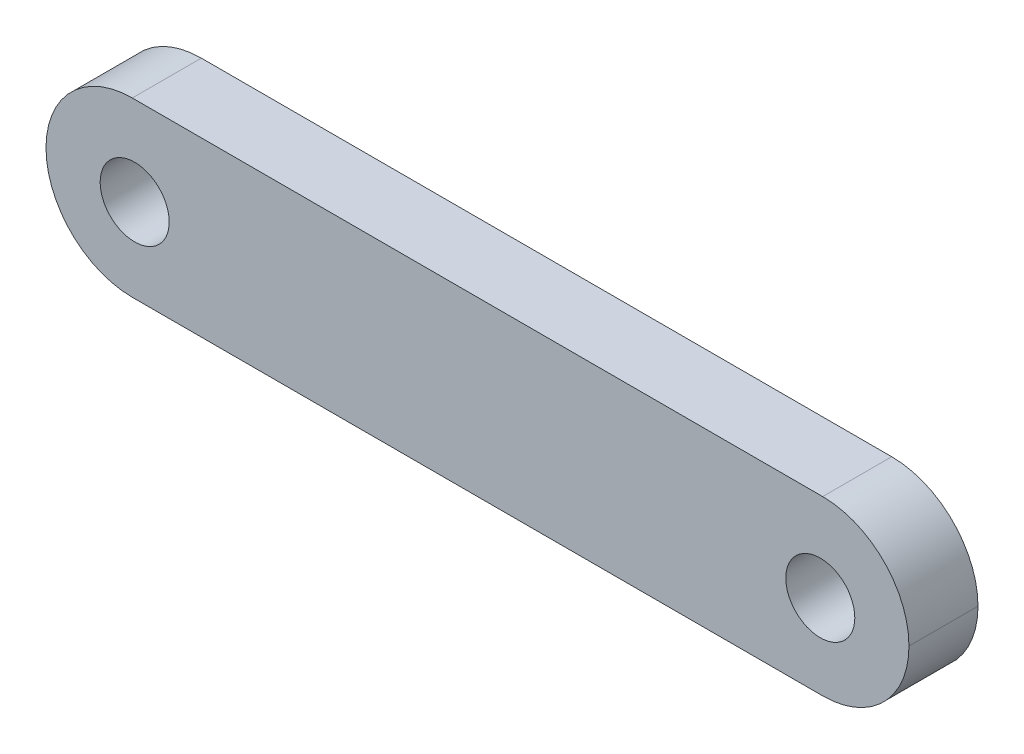
ISO-10303-21;
HEADER;
FILE_DESCRIPTION(('STEP AP214'),'2;1');
FILE_NAME('part.step','',(''),(''),'','','');
FILE_SCHEMA(('AUTOMOTIVE_DESIGN { 1 0 10303 214 1 1 1 1 }'));
ENDSEC;
DATA;
#1=APPLICATION_CONTEXT('core data for automotive mechanical design processes');
#2=APPLICATION_PROTOCOL_DEFINITION('international standard','automotive_design',2000,#1);
#3=PRODUCT_CONTEXT('',#1,'mechanical');
#4=PRODUCT('Part','Part','',(#3));
#5=PRODUCT_RELATED_PRODUCT_CATEGORY('part','',(#4));
#6=PRODUCT_DEFINITION_FORMATION('','',#4);
#7=PRODUCT_DEFINITION_CONTEXT('part definition',#1,'design');
#8=PRODUCT_DEFINITION('design','',#6,#7);
#9=PRODUCT_DEFINITION_SHAPE('','',#8);
#10=(LENGTH_UNIT() NAMED_UNIT(*) SI_UNIT(.MILLI.,.METRE.));
#11=(NAMED_UNIT(*) PLANE_ANGLE_UNIT() SI_UNIT($,.RADIAN.));
#12=(NAMED_UNIT(*) SI_UNIT($,.STERADIAN.) SOLID_ANGLE_UNIT());
#13=UNCERTAINTY_MEASURE_WITH_UNIT(LENGTH_MEASURE(1.E-05),#10,'distance_accuracy_value','');
#14=(GEOMETRIC_REPRESENTATION_CONTEXT(3) GLOBAL_UNCERTAINTY_ASSIGNED_CONTEXT((#13)) GLOBAL_UNIT_ASSIGNED_CONTEXT((#10,
#11,#12)) REPRESENTATION_CONTEXT('',''));
#15=CARTESIAN_POINT('',(0.,0.,0.));
#16=DIRECTION('',(0.,0.,1.));
#17=DIRECTION('',(1.,0.,0.));
#18=AXIS2_PLACEMENT_3D('',#15,#16,#17);
#19=CARTESIAN_POINT('',(0.,0.,2.));
#20=DIRECTION('',(0.,0.,1.));
#21=DIRECTION('',(1.,0.,0.));
#22=AXIS2_PLACEMENT_3D('',#19,#20,#21);
#23=PLANE('',#22);
#24=CARTESIAN_POINT('',(9.93104269484559,-0.076752974089361,2.));
#25=DIRECTION('',(0.,0.,1.));
#26=DIRECTION('',(1.,0.,0.));
#27=AXIS2_PLACEMENT_3D('',#24,#25,#26);
#28=CIRCLE('',#27,1.);
#29=CARTESIAN_POINT('',(10.9310426948456,-0.076752974089361,2.));
#30=VERTEX_POINT('',#29);
#31=EDGE_CURVE('E126',#30,#30,#28,.T.);
#32=ORIENTED_EDGE('',*,*,#31,.F.);
#33=EDGE_LOOP('',(#32));
#34=FACE_BOUND('',#33,.T.);
#35=CARTESIAN_POINT('',(-10.,0.,2.));
#36=DIRECTION('',(0.,0.,1.));
#37=DIRECTION('',(1.,0.,0.));
#38=AXIS2_PLACEMENT_3D('',#35,#36,#37);
#39=CIRCLE('',#38,2.5);
#40=CARTESIAN_POINT('',(-10.,2.5,2.));
#41=VERTEX_POINT('',#40);
#42=CARTESIAN_POINT('',(-12.5,0.,2.));
#43=VERTEX_POINT('',#42);
#44=EDGE_CURVE('E56',#41,#43,#39,.T.);
#45=ORIENTED_EDGE('',*,*,#44,.T.);
#46=CARTESIAN_POINT('',(-10.,0.,2.));
#47=DIRECTION('',(0.,0.,1.));
#48=DIRECTION('',(1.,0.,0.));
#49=AXIS2_PLACEMENT_3D('',#46,#47,#48);
#50=CIRCLE('',#49,2.5);
#51=CARTESIAN_POINT('',(-10.,-2.5,2.));
#52=VERTEX_POINT('',#51);
#53=EDGE_CURVE('E138',#43,#52,#50,.T.);
#54=ORIENTED_EDGE('',*,*,#53,.T.);
#55=DIRECTION('',(1.,0.,0.));
#56=VECTOR('',#55,1.);
#57=CARTESIAN_POINT('',(-12.5,-2.5,2.));
#58=LINE('',#57,#56);
#59=CARTESIAN_POINT('',(10.,-2.5,2.));
#60=VERTEX_POINT('',#59);
#61=EDGE_CURVE('E114',#52,#60,#58,.T.);
#62=ORIENTED_EDGE('',*,*,#61,.T.);
#63=CARTESIAN_POINT('',(10.,0.,2.));
#64=DIRECTION('',(0.,0.,1.));
#65=DIRECTION('',(1.,0.,0.));
#66=AXIS2_PLACEMENT_3D('',#63,#64,#65);
#67=CIRCLE('',#66,2.5);
#68=CARTESIAN_POINT('',(12.5,0.,2.));
#69=VERTEX_POINT('',#68);
#70=EDGE_CURVE('E135',#60,#69,#67,.T.);
#71=ORIENTED_EDGE('',*,*,#70,.T.);
#72=CARTESIAN_POINT('',(10.,0.,2.));
#73=DIRECTION('',(0.,0.,1.));
#74=DIRECTION('',(1.,0.,0.));
#75=AXIS2_PLACEMENT_3D('',#72,#73,#74);
#76=CIRCLE('',#75,2.5);
#77=CARTESIAN_POINT('',(10.,2.5,2.));
#78=VERTEX_POINT('',#77);
#79=EDGE_CURVE('E103',#69,#78,#76,.T.);
#80=ORIENTED_EDGE('',*,*,#79,.T.);
#81=DIRECTION('',(-1.,0.,0.));
#82=VECTOR('',#81,1.);
#83=CARTESIAN_POINT('',(-12.5,2.5,2.));
#84=LINE('',#83,#82);
#85=EDGE_CURVE('E122',#78,#41,#84,.T.);
#86=ORIENTED_EDGE('',*,*,#85,.T.);
#87=EDGE_LOOP('',(#45,#54,#62,#71,#80,#86));
#88=FACE_BOUND('',#87,.T.);
#89=CARTESIAN_POINT('',(-9.93104269484559,-0.076752974089361,2.));
#90=DIRECTION('',(0.,0.,1.));
#91=DIRECTION('',(-1.,0.,0.));
#92=AXIS2_PLACEMENT_3D('',#89,#90,#91);
#93=CIRCLE('',#92,1.);
#94=CARTESIAN_POINT('',(-10.9310426948456,-0.076752974089361,2.));
#95=VERTEX_POINT('',#94);
#96=EDGE_CURVE('E142',#95,#95,#93,.T.);
#97=ORIENTED_EDGE('',*,*,#96,.F.);
#98=EDGE_LOOP('',(#97));
#99=FACE_BOUND('',#98,.T.);
#100=ADVANCED_FACE('F39',(#34,#88,#99),#23,.T.);
#101=CARTESIAN_POINT('',(0.,0.,0.));
#102=DIRECTION('',(0.,0.,1.));
#103=DIRECTION('',(1.,0.,0.));
#104=AXIS2_PLACEMENT_3D('',#101,#102,#103);
#105=PLANE('',#104);
#106=DIRECTION('',(1.,0.,0.));
#107=VECTOR('',#106,1.);
#108=CARTESIAN_POINT('',(-12.5,-2.5,0.));
#109=LINE('',#108,#107);
#110=CARTESIAN_POINT('',(-10.,-2.5,0.));
#111=VERTEX_POINT('',#110);
#112=CARTESIAN_POINT('',(10.,-2.5,0.));
#113=VERTEX_POINT('',#112);
#114=EDGE_CURVE('E111',#111,#113,#109,.T.);
#115=ORIENTED_EDGE('',*,*,#114,.F.);
#116=CARTESIAN_POINT('',(-10.,0.,0.));
#117=DIRECTION('',(0.,0.,1.));
#118=DIRECTION('',(1.,0.,0.));
#119=AXIS2_PLACEMENT_3D('',#116,#117,#118);
#120=CIRCLE('',#119,2.5);
#121=CARTESIAN_POINT('',(-12.5,0.,0.));
#122=VERTEX_POINT('',#121);
#123=EDGE_CURVE('E94',#111,#122,#120,.F.);
#124=ORIENTED_EDGE('',*,*,#123,.T.);
#125=CARTESIAN_POINT('',(-10.,0.,0.));
#126=DIRECTION('',(0.,0.,1.));
#127=DIRECTION('',(1.,0.,0.));
#128=AXIS2_PLACEMENT_3D('',#125,#126,#127);
#129=CIRCLE('',#128,2.5);
#130=CARTESIAN_POINT('',(-10.,2.5,0.));
#131=VERTEX_POINT('',#130);
#132=EDGE_CURVE('E104',#122,#131,#129,.F.);
#133=ORIENTED_EDGE('',*,*,#132,.T.);
#134=DIRECTION('',(-1.,0.,0.));
#135=VECTOR('',#134,1.);
#136=CARTESIAN_POINT('',(-12.5,2.5,0.));
#137=LINE('',#136,#135);
#138=CARTESIAN_POINT('',(10.,2.5,0.));
#139=VERTEX_POINT('',#138);
#140=EDGE_CURVE('E123',#139,#131,#137,.T.);
#141=ORIENTED_EDGE('',*,*,#140,.F.);
#142=CARTESIAN_POINT('',(10.,0.,0.));
#143=DIRECTION('',(0.,0.,1.));
#144=DIRECTION('',(1.,0.,0.));
#145=AXIS2_PLACEMENT_3D('',#142,#143,#144);
#146=CIRCLE('',#145,2.5);
#147=CARTESIAN_POINT('',(12.5,0.,0.));
#148=VERTEX_POINT('',#147);
#149=EDGE_CURVE('E115',#139,#148,#146,.F.);
#150=ORIENTED_EDGE('',*,*,#149,.T.);
#151=CARTESIAN_POINT('',(10.,0.,0.));
#152=DIRECTION('',(0.,0.,1.));
#153=DIRECTION('',(1.,0.,0.));
#154=AXIS2_PLACEMENT_3D('',#151,#152,#153);
#155=CIRCLE('',#154,2.5);
#156=EDGE_CURVE('E121',#148,#113,#155,.F.);
#157=ORIENTED_EDGE('',*,*,#156,.T.);
#158=EDGE_LOOP('',(#115,#124,#133,#141,#150,#157));
#159=FACE_BOUND('',#158,.T.);
#160=CARTESIAN_POINT('',(9.93104269484559,-0.076752974089361,0.));
#161=DIRECTION('',(0.,0.,1.));
#162=DIRECTION('',(1.,0.,0.));
#163=AXIS2_PLACEMENT_3D('',#160,#161,#162);
#164=CIRCLE('',#163,1.);
#165=CARTESIAN_POINT('',(10.9310426948456,-0.076752974089361,0.));
#166=VERTEX_POINT('',#165);
#167=EDGE_CURVE('E158',#166,#166,#164,.T.);
#168=ORIENTED_EDGE('',*,*,#167,.T.);
#169=EDGE_LOOP('',(#168));
#170=FACE_BOUND('',#169,.T.);
#171=CARTESIAN_POINT('',(-9.93104269484559,-0.076752974089361,0.));
#172=DIRECTION('',(0.,0.,1.));
#173=DIRECTION('',(-1.,0.,0.));
#174=AXIS2_PLACEMENT_3D('',#171,#172,#173);
#175=CIRCLE('',#174,1.);
#176=CARTESIAN_POINT('',(-10.9310426948456,-0.076752974089361,0.));
#177=VERTEX_POINT('',#176);
#178=EDGE_CURVE('E140',#177,#177,#175,.T.);
#179=ORIENTED_EDGE('',*,*,#178,.T.);
#180=EDGE_LOOP('',(#179));
#181=FACE_BOUND('',#180,.T.);
#182=ADVANCED_FACE('F118',(#159,#170,#181),#105,.F.);
#183=CARTESIAN_POINT('',(-12.5,2.5,2.));
#184=DIRECTION('',(0.,-1.,0.));
#185=DIRECTION('',(0.,0.,-1.));
#186=AXIS2_PLACEMENT_3D('',#183,#184,#185);
#187=PLANE('',#186);
#188=ORIENTED_EDGE('',*,*,#140,.T.);
#189=DIRECTION('',(0.,0.,-1.));
#190=VECTOR('',#189,1.);
#191=CARTESIAN_POINT('',(-10.,2.5,2.));
#192=LINE('',#191,#190);
#193=EDGE_CURVE('E11',#131,#41,#192,.F.);
#194=ORIENTED_EDGE('',*,*,#193,.T.);
#195=ORIENTED_EDGE('',*,*,#85,.F.);
#196=DIRECTION('',(0.,0.,-1.));
#197=VECTOR('',#196,1.);
#198=CARTESIAN_POINT('',(10.,2.5,2.));
#199=LINE('',#198,#197);
#200=EDGE_CURVE('E48',#78,#139,#199,.T.);
#201=ORIENTED_EDGE('',*,*,#200,.T.);
#202=EDGE_LOOP('',(#188,#194,#195,#201));
#203=FACE_BOUND('',#202,.T.);
#204=ADVANCED_FACE('F153',(#203),#187,.F.);
#205=CARTESIAN_POINT('',(-12.5,-2.5,2.));
#206=DIRECTION('',(0.,1.,0.));
#207=DIRECTION('',(0.,0.,1.));
#208=AXIS2_PLACEMENT_3D('',#205,#206,#207);
#209=PLANE('',#208);
#210=ORIENTED_EDGE('',*,*,#61,.F.);
#211=DIRECTION('',(0.,0.,-1.));
#212=VECTOR('',#211,1.);
#213=CARTESIAN_POINT('',(-10.,-2.5,2.));
#214=LINE('',#213,#212);
#215=EDGE_CURVE('E98',#52,#111,#214,.T.);
#216=ORIENTED_EDGE('',*,*,#215,.T.);
#217=ORIENTED_EDGE('',*,*,#114,.T.);
#218=DIRECTION('',(0.,0.,-1.));
#219=VECTOR('',#218,1.);
#220=CARTESIAN_POINT('',(10.,-2.5,2.));
#221=LINE('',#220,#219);
#222=EDGE_CURVE('E116',#113,#60,#221,.F.);
#223=ORIENTED_EDGE('',*,*,#222,.T.);
#224=EDGE_LOOP('',(#210,#216,#217,#223));
#225=FACE_BOUND('',#224,.T.);
#226=ADVANCED_FACE('F109',(#225),#209,.F.);
#227=CARTESIAN_POINT('',(9.93104269484559,-0.076752974089361,2.));
#228=DIRECTION('',(0.,0.,-1.));
#229=DIRECTION('',(-1.,0.,0.));
#230=AXIS2_PLACEMENT_3D('',#227,#228,#229);
#231=CYLINDRICAL_SURFACE('',#230,1.);
#232=ORIENTED_EDGE('',*,*,#31,.T.);
#233=EDGE_LOOP('',(#232));
#234=FACE_BOUND('',#233,.T.);
#235=ORIENTED_EDGE('',*,*,#167,.F.);
#236=EDGE_LOOP('',(#235));
#237=FACE_BOUND('',#236,.T.);
#238=ADVANCED_FACE('F178',(#234,#237),#231,.F.);
#239=CARTESIAN_POINT('',(-9.93104269484559,-0.076752974089361,2.));
#240=DIRECTION('',(0.,0.,-1.));
#241=DIRECTION('',(-1.,0.,0.));
#242=AXIS2_PLACEMENT_3D('',#239,#240,#241);
#243=CYLINDRICAL_SURFACE('',#242,1.);
#244=ORIENTED_EDGE('',*,*,#96,.T.);
#245=EDGE_LOOP('',(#244));
#246=FACE_BOUND('',#245,.T.);
#247=ORIENTED_EDGE('',*,*,#178,.F.);
#248=EDGE_LOOP('',(#247));
#249=FACE_BOUND('',#248,.T.);
#250=ADVANCED_FACE('F166',(#246,#249),#243,.F.);
#251=CARTESIAN_POINT('',(-10.,0.,2.));
#252=DIRECTION('',(0.,0.,-1.));
#253=DIRECTION('',(-1.,0.,0.));
#254=AXIS2_PLACEMENT_3D('',#251,#252,#253);
#255=CYLINDRICAL_SURFACE('',#254,2.5);
#256=DIRECTION('',(0.,0.,-1.));
#257=VECTOR('',#256,1.);
#258=CARTESIAN_POINT('',(-12.5,0.,2.));
#259=LINE('',#258,#257);
#260=EDGE_CURVE('E99',#43,#122,#259,.T.);
#261=ORIENTED_EDGE('',*,*,#260,.F.);
#262=ORIENTED_EDGE('',*,*,#44,.F.);
#263=ORIENTED_EDGE('',*,*,#193,.F.);
#264=ORIENTED_EDGE('',*,*,#132,.F.);
#265=EDGE_LOOP('',(#261,#262,#263,#264));
#266=FACE_BOUND('',#265,.T.);
#267=ADVANCED_FACE('F156',(#266),#255,.T.);
#268=CARTESIAN_POINT('',(-10.,0.,2.));
#269=DIRECTION('',(0.,0.,-1.));
#270=DIRECTION('',(-1.,0.,0.));
#271=AXIS2_PLACEMENT_3D('',#268,#269,#270);
#272=CYLINDRICAL_SURFACE('',#271,2.5);
#273=ORIENTED_EDGE('',*,*,#53,.F.);
#274=ORIENTED_EDGE('',*,*,#260,.T.);
#275=ORIENTED_EDGE('',*,*,#123,.F.);
#276=ORIENTED_EDGE('',*,*,#215,.F.);
#277=EDGE_LOOP('',(#273,#274,#275,#276));
#278=FACE_BOUND('',#277,.T.);
#279=ADVANCED_FACE('F97',(#278),#272,.T.);
#280=CARTESIAN_POINT('',(10.,0.,2.));
#281=DIRECTION('',(0.,0.,-1.));
#282=DIRECTION('',(-1.,0.,0.));
#283=AXIS2_PLACEMENT_3D('',#280,#281,#282);
#284=CYLINDRICAL_SURFACE('',#283,2.5);
#285=ORIENTED_EDGE('',*,*,#200,.F.);
#286=ORIENTED_EDGE('',*,*,#79,.F.);
#287=DIRECTION('',(0.,0.,-1.));
#288=VECTOR('',#287,1.);
#289=CARTESIAN_POINT('',(12.5,0.,2.));
#290=LINE('',#289,#288);
#291=EDGE_CURVE('E43',#148,#69,#290,.F.);
#292=ORIENTED_EDGE('',*,*,#291,.F.);
#293=ORIENTED_EDGE('',*,*,#149,.F.);
#294=EDGE_LOOP('',(#285,#286,#292,#293));
#295=FACE_BOUND('',#294,.T.);
#296=ADVANCED_FACE('F41',(#295),#284,.T.);
#297=CARTESIAN_POINT('',(10.,0.,2.));
#298=DIRECTION('',(0.,0.,-1.));
#299=DIRECTION('',(-1.,0.,0.));
#300=AXIS2_PLACEMENT_3D('',#297,#298,#299);
#301=CYLINDRICAL_SURFACE('',#300,2.5);
#302=ORIENTED_EDGE('',*,*,#70,.F.);
#303=ORIENTED_EDGE('',*,*,#222,.F.);
#304=ORIENTED_EDGE('',*,*,#156,.F.);
#305=ORIENTED_EDGE('',*,*,#291,.T.);
#306=EDGE_LOOP('',(#302,#303,#304,#305));
#307=FACE_BOUND('',#306,.T.);
#308=ADVANCED_FACE('F147',(#307),#301,.T.);
#309=CLOSED_SHELL('',(#100,#182,#204,#226,#238,#250,#267,#279,#296,#308));
#310=MANIFOLD_SOLID_BREP('B2',#309);
#311=ADVANCED_BREP_SHAPE_REPRESENTATION('',(#18,#310),#14);
#312=SHAPE_DEFINITION_REPRESENTATION(#9,#311);
ENDSEC;
END-ISO-10303-21;
